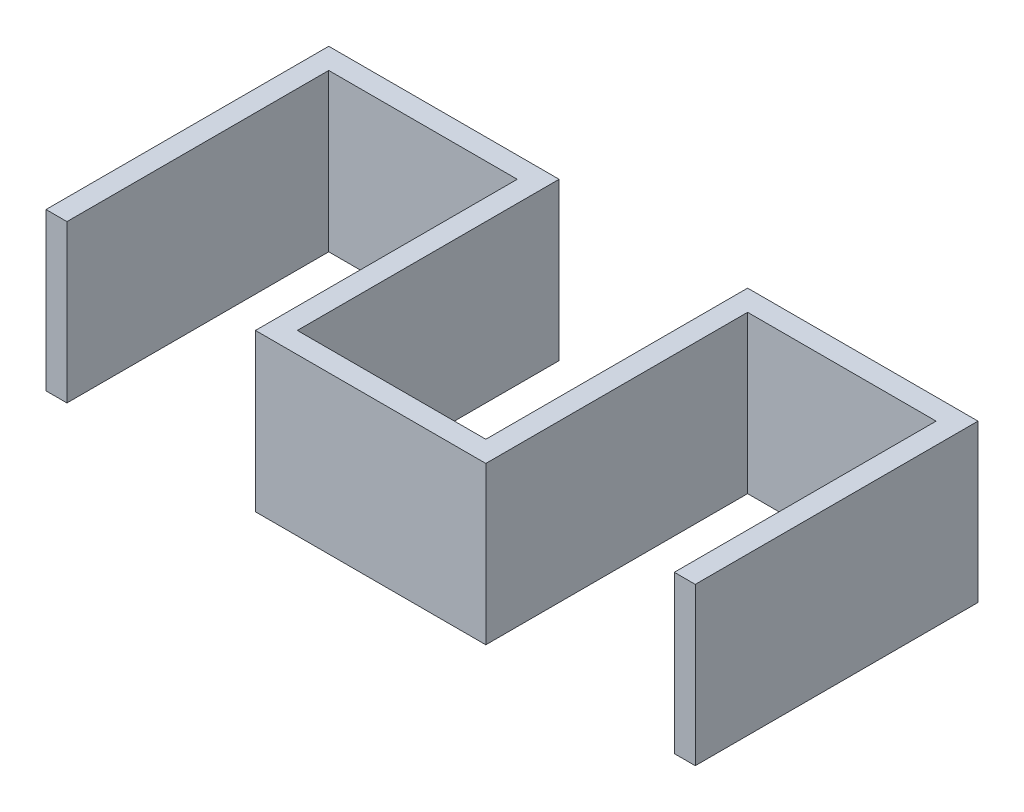
ISO-10303-21;
HEADER;
FILE_DESCRIPTION(('STEP AP214'),'2;1');
FILE_NAME('part.step','',(''),(''),'','','');
FILE_SCHEMA(('AUTOMOTIVE_DESIGN { 1 0 10303 214 1 1 1 1 }'));
ENDSEC;
DATA;
#1=APPLICATION_CONTEXT('core data for automotive mechanical design processes');
#2=APPLICATION_PROTOCOL_DEFINITION('international standard','automotive_design',2000,#1);
#3=PRODUCT_CONTEXT('',#1,'mechanical');
#4=PRODUCT('Part','Part','',(#3));
#5=PRODUCT_RELATED_PRODUCT_CATEGORY('part','',(#4));
#6=PRODUCT_DEFINITION_FORMATION('','',#4);
#7=PRODUCT_DEFINITION_CONTEXT('part definition',#1,'design');
#8=PRODUCT_DEFINITION('design','',#6,#7);
#9=PRODUCT_DEFINITION_SHAPE('','',#8);
#10=(LENGTH_UNIT() NAMED_UNIT(*) SI_UNIT(.MILLI.,.METRE.));
#11=(NAMED_UNIT(*) PLANE_ANGLE_UNIT() SI_UNIT($,.RADIAN.));
#12=(NAMED_UNIT(*) SI_UNIT($,.STERADIAN.) SOLID_ANGLE_UNIT());
#13=UNCERTAINTY_MEASURE_WITH_UNIT(LENGTH_MEASURE(1.E-05),#10,'distance_accuracy_value','');
#14=(GEOMETRIC_REPRESENTATION_CONTEXT(3) GLOBAL_UNCERTAINTY_ASSIGNED_CONTEXT((#13)) GLOBAL_UNIT_ASSIGNED_CONTEXT((#10,
#11,#12)) REPRESENTATION_CONTEXT('',''));
#15=CARTESIAN_POINT('',(0.,0.,0.));
#16=DIRECTION('',(0.,0.,1.));
#17=DIRECTION('',(1.,0.,0.));
#18=AXIS2_PLACEMENT_3D('',#15,#16,#17);
#19=CARTESIAN_POINT('',(58.,15.,-25.));
#20=DIRECTION('',(1.,0.,0.));
#21=DIRECTION('',(0.,0.,-1.));
#22=AXIS2_PLACEMENT_3D('',#19,#20,#21);
#23=PLANE('',#22);
#24=DIRECTION('',(0.,0.,1.));
#25=VECTOR('',#24,1.);
#26=CARTESIAN_POINT('',(58.,0.,-25.));
#27=LINE('',#26,#25);
#28=CARTESIAN_POINT('',(58.,0.,-25.));
#29=VERTEX_POINT('',#28);
#30=CARTESIAN_POINT('',(58.,0.,0.));
#31=VERTEX_POINT('',#30);
#32=EDGE_CURVE('E182',#29,#31,#27,.T.);
#33=ORIENTED_EDGE('',*,*,#32,.T.);
#34=DIRECTION('',(0.,-1.,0.));
#35=VECTOR('',#34,1.);
#36=CARTESIAN_POINT('',(58.,15.,0.));
#37=LINE('',#36,#35);
#38=CARTESIAN_POINT('',(58.,15.,0.));
#39=VERTEX_POINT('',#38);
#40=EDGE_CURVE('E11',#39,#31,#37,.T.);
#41=ORIENTED_EDGE('',*,*,#40,.F.);
#42=DIRECTION('',(0.,0.,1.));
#43=VECTOR('',#42,1.);
#44=CARTESIAN_POINT('',(58.,15.,-25.));
#45=LINE('',#44,#43);
#46=CARTESIAN_POINT('',(58.,15.,-25.));
#47=VERTEX_POINT('',#46);
#48=EDGE_CURVE('E119',#47,#39,#45,.T.);
#49=ORIENTED_EDGE('',*,*,#48,.F.);
#50=DIRECTION('',(0.,-1.,0.));
#51=VECTOR('',#50,1.);
#52=CARTESIAN_POINT('',(58.,15.,-25.));
#53=LINE('',#52,#51);
#54=EDGE_CURVE('E178',#47,#29,#53,.T.);
#55=ORIENTED_EDGE('',*,*,#54,.T.);
#56=EDGE_LOOP('',(#33,#41,#49,#55));
#57=FACE_BOUND('',#56,.T.);
#58=ADVANCED_FACE('F39',(#57),#23,.F.);
#59=CARTESIAN_POINT('',(60.,15.,0.));
#60=DIRECTION('',(0.,0.,1.));
#61=DIRECTION('',(1.,0.,0.));
#62=AXIS2_PLACEMENT_3D('',#59,#60,#61);
#63=PLANE('',#62);
#64=DIRECTION('',(-1.,0.,0.));
#65=VECTOR('',#64,1.);
#66=CARTESIAN_POINT('',(60.,0.,0.));
#67=LINE('',#66,#65);
#68=CARTESIAN_POINT('',(60.,0.,0.));
#69=VERTEX_POINT('',#68);
#70=EDGE_CURVE('E185',#69,#31,#67,.T.);
#71=ORIENTED_EDGE('',*,*,#70,.F.);
#72=DIRECTION('',(0.,-1.,0.));
#73=VECTOR('',#72,1.);
#74=CARTESIAN_POINT('',(60.,15.,0.));
#75=LINE('',#74,#73);
#76=CARTESIAN_POINT('',(60.,15.,0.));
#77=VERTEX_POINT('',#76);
#78=EDGE_CURVE('E47',#77,#69,#75,.T.);
#79=ORIENTED_EDGE('',*,*,#78,.F.);
#80=DIRECTION('',(-1.,0.,0.));
#81=VECTOR('',#80,1.);
#82=CARTESIAN_POINT('',(60.,15.,0.));
#83=LINE('',#82,#81);
#84=EDGE_CURVE('E267',#77,#39,#83,.T.);
#85=ORIENTED_EDGE('',*,*,#84,.T.);
#86=ORIENTED_EDGE('',*,*,#40,.T.);
#87=EDGE_LOOP('',(#71,#79,#85,#86));
#88=FACE_BOUND('',#87,.T.);
#89=ADVANCED_FACE('F254',(#88),#63,.T.);
#90=CARTESIAN_POINT('',(60.,15.,-25.));
#91=DIRECTION('',(1.,0.,0.));
#92=DIRECTION('',(0.,0.,-1.));
#93=AXIS2_PLACEMENT_3D('',#90,#91,#92);
#94=PLANE('',#93);
#95=DIRECTION('',(0.,0.,-1.));
#96=VECTOR('',#95,1.);
#97=CARTESIAN_POINT('',(60.,0.,-25.));
#98=LINE('',#97,#96);
#99=CARTESIAN_POINT('',(60.,0.,-27.));
#100=VERTEX_POINT('',#99);
#101=EDGE_CURVE('E188',#100,#69,#98,.F.);
#102=ORIENTED_EDGE('',*,*,#101,.F.);
#103=DIRECTION('',(0.,-1.,0.));
#104=VECTOR('',#103,1.);
#105=CARTESIAN_POINT('',(60.,15.,-27.));
#106=LINE('',#105,#104);
#107=CARTESIAN_POINT('',(60.,15.,-27.));
#108=VERTEX_POINT('',#107);
#109=EDGE_CURVE('E244',#108,#100,#106,.T.);
#110=ORIENTED_EDGE('',*,*,#109,.F.);
#111=DIRECTION('',(0.,0.,-1.));
#112=VECTOR('',#111,1.);
#113=CARTESIAN_POINT('',(60.,15.,-25.));
#114=LINE('',#113,#112);
#115=EDGE_CURVE('E251',#108,#77,#114,.F.);
#116=ORIENTED_EDGE('',*,*,#115,.T.);
#117=ORIENTED_EDGE('',*,*,#78,.T.);
#118=EDGE_LOOP('',(#102,#110,#116,#117));
#119=FACE_BOUND('',#118,.T.);
#120=ADVANCED_FACE('F249',(#119),#94,.T.);
#121=CARTESIAN_POINT('',(40.,15.,-27.));
#122=DIRECTION('',(0.,0.,-1.));
#123=DIRECTION('',(-1.,0.,0.));
#124=AXIS2_PLACEMENT_3D('',#121,#122,#123);
#125=PLANE('',#124);
#126=DIRECTION('',(1.,0.,0.));
#127=VECTOR('',#126,1.);
#128=CARTESIAN_POINT('',(40.,0.,-27.));
#129=LINE('',#128,#127);
#130=CARTESIAN_POINT('',(38.,0.,-27.));
#131=VERTEX_POINT('',#130);
#132=EDGE_CURVE('E191',#131,#100,#129,.T.);
#133=ORIENTED_EDGE('',*,*,#132,.F.);
#134=DIRECTION('',(0.,-1.,0.));
#135=VECTOR('',#134,1.);
#136=CARTESIAN_POINT('',(38.,15.,-27.));
#137=LINE('',#136,#135);
#138=CARTESIAN_POINT('',(38.,15.,-27.));
#139=VERTEX_POINT('',#138);
#140=EDGE_CURVE('E242',#139,#131,#137,.T.);
#141=ORIENTED_EDGE('',*,*,#140,.F.);
#142=DIRECTION('',(1.,0.,0.));
#143=VECTOR('',#142,1.);
#144=CARTESIAN_POINT('',(40.,15.,-27.));
#145=LINE('',#144,#143);
#146=EDGE_CURVE('E264',#139,#108,#145,.T.);
#147=ORIENTED_EDGE('',*,*,#146,.T.);
#148=ORIENTED_EDGE('',*,*,#109,.T.);
#149=EDGE_LOOP('',(#133,#141,#147,#148));
#150=FACE_BOUND('',#149,.T.);
#151=ADVANCED_FACE('F261',(#150),#125,.T.);
#152=CARTESIAN_POINT('',(38.,15.,0.));
#153=DIRECTION('',(-1.,0.,0.));
#154=DIRECTION('',(0.,0.,1.));
#155=AXIS2_PLACEMENT_3D('',#152,#153,#154);
#156=PLANE('',#155);
#157=DIRECTION('',(0.,0.,-1.));
#158=VECTOR('',#157,1.);
#159=CARTESIAN_POINT('',(38.,0.,0.));
#160=LINE('',#159,#158);
#161=CARTESIAN_POINT('',(38.,0.,-2.));
#162=VERTEX_POINT('',#161);
#163=EDGE_CURVE('E194',#162,#131,#160,.T.);
#164=ORIENTED_EDGE('',*,*,#163,.F.);
#165=DIRECTION('',(0.,-1.,0.));
#166=VECTOR('',#165,1.);
#167=CARTESIAN_POINT('',(38.,15.,-2.));
#168=LINE('',#167,#166);
#169=CARTESIAN_POINT('',(38.,15.,-2.));
#170=VERTEX_POINT('',#169);
#171=EDGE_CURVE('E240',#170,#162,#168,.T.);
#172=ORIENTED_EDGE('',*,*,#171,.F.);
#173=DIRECTION('',(0.,0.,-1.));
#174=VECTOR('',#173,1.);
#175=CARTESIAN_POINT('',(38.,15.,0.));
#176=LINE('',#175,#174);
#177=EDGE_CURVE('E269',#170,#139,#176,.T.);
#178=ORIENTED_EDGE('',*,*,#177,.T.);
#179=ORIENTED_EDGE('',*,*,#140,.T.);
#180=EDGE_LOOP('',(#164,#172,#178,#179));
#181=FACE_BOUND('',#180,.T.);
#182=ADVANCED_FACE('F326',(#181),#156,.T.);
#183=CARTESIAN_POINT('',(18.,15.,-2.));
#184=DIRECTION('',(0.,0.,-1.));
#185=DIRECTION('',(-1.,0.,0.));
#186=AXIS2_PLACEMENT_3D('',#183,#184,#185);
#187=PLANE('',#186);
#188=DIRECTION('',(1.,0.,0.));
#189=VECTOR('',#188,1.);
#190=CARTESIAN_POINT('',(18.,0.,-2.));
#191=LINE('',#190,#189);
#192=CARTESIAN_POINT('',(20.,0.,-2.));
#193=VERTEX_POINT('',#192);
#194=EDGE_CURVE('E197',#193,#162,#191,.T.);
#195=ORIENTED_EDGE('',*,*,#194,.F.);
#196=DIRECTION('',(0.,-1.,0.));
#197=VECTOR('',#196,1.);
#198=CARTESIAN_POINT('',(20.,15.,-2.));
#199=LINE('',#198,#197);
#200=CARTESIAN_POINT('',(20.,15.,-2.));
#201=VERTEX_POINT('',#200);
#202=EDGE_CURVE('E238',#201,#193,#199,.T.);
#203=ORIENTED_EDGE('',*,*,#202,.F.);
#204=DIRECTION('',(1.,0.,0.));
#205=VECTOR('',#204,1.);
#206=CARTESIAN_POINT('',(18.,15.,-2.));
#207=LINE('',#206,#205);
#208=EDGE_CURVE('E275',#201,#170,#207,.T.);
#209=ORIENTED_EDGE('',*,*,#208,.T.);
#210=ORIENTED_EDGE('',*,*,#171,.T.);
#211=EDGE_LOOP('',(#195,#203,#209,#210));
#212=FACE_BOUND('',#211,.T.);
#213=ADVANCED_FACE('F329',(#212),#187,.T.);
#214=CARTESIAN_POINT('',(20.,15.,-25.));
#215=DIRECTION('',(1.,0.,0.));
#216=DIRECTION('',(0.,0.,-1.));
#217=AXIS2_PLACEMENT_3D('',#214,#215,#216);
#218=PLANE('',#217);
#219=DIRECTION('',(0.,0.,1.));
#220=VECTOR('',#219,1.);
#221=CARTESIAN_POINT('',(20.,0.,-25.));
#222=LINE('',#221,#220);
#223=CARTESIAN_POINT('',(20.,0.,-27.));
#224=VERTEX_POINT('',#223);
#225=EDGE_CURVE('E200',#224,#193,#222,.T.);
#226=ORIENTED_EDGE('',*,*,#225,.F.);
#227=DIRECTION('',(0.,-1.,0.));
#228=VECTOR('',#227,1.);
#229=CARTESIAN_POINT('',(20.,15.,-27.));
#230=LINE('',#229,#228);
#231=CARTESIAN_POINT('',(20.,15.,-27.));
#232=VERTEX_POINT('',#231);
#233=EDGE_CURVE('E236',#232,#224,#230,.T.);
#234=ORIENTED_EDGE('',*,*,#233,.F.);
#235=DIRECTION('',(0.,0.,1.));
#236=VECTOR('',#235,1.);
#237=CARTESIAN_POINT('',(20.,15.,-25.));
#238=LINE('',#237,#236);
#239=EDGE_CURVE('E278',#232,#201,#238,.T.);
#240=ORIENTED_EDGE('',*,*,#239,.T.);
#241=ORIENTED_EDGE('',*,*,#202,.T.);
#242=EDGE_LOOP('',(#226,#234,#240,#241));
#243=FACE_BOUND('',#242,.T.);
#244=ADVANCED_FACE('F333',(#243),#218,.T.);
#245=CARTESIAN_POINT('',(0.,15.,-27.));
#246=DIRECTION('',(0.,0.,-1.));
#247=DIRECTION('',(-1.,0.,0.));
#248=AXIS2_PLACEMENT_3D('',#245,#246,#247);
#249=PLANE('',#248);
#250=DIRECTION('',(1.,0.,0.));
#251=VECTOR('',#250,1.);
#252=CARTESIAN_POINT('',(0.,0.,-27.));
#253=LINE('',#252,#251);
#254=CARTESIAN_POINT('',(-2.,0.,-27.));
#255=VERTEX_POINT('',#254);
#256=EDGE_CURVE('E203',#255,#224,#253,.T.);
#257=ORIENTED_EDGE('',*,*,#256,.F.);
#258=DIRECTION('',(0.,-1.,0.));
#259=VECTOR('',#258,1.);
#260=CARTESIAN_POINT('',(-2.,15.,-27.));
#261=LINE('',#260,#259);
#262=CARTESIAN_POINT('',(-2.,15.,-27.));
#263=VERTEX_POINT('',#262);
#264=EDGE_CURVE('E234',#263,#255,#261,.T.);
#265=ORIENTED_EDGE('',*,*,#264,.F.);
#266=DIRECTION('',(1.,0.,0.));
#267=VECTOR('',#266,1.);
#268=CARTESIAN_POINT('',(0.,15.,-27.));
#269=LINE('',#268,#267);
#270=EDGE_CURVE('E281',#263,#232,#269,.T.);
#271=ORIENTED_EDGE('',*,*,#270,.T.);
#272=ORIENTED_EDGE('',*,*,#233,.T.);
#273=EDGE_LOOP('',(#257,#265,#271,#272));
#274=FACE_BOUND('',#273,.T.);
#275=ADVANCED_FACE('F337',(#274),#249,.T.);
#276=CARTESIAN_POINT('',(-2.,15.,0.));
#277=DIRECTION('',(-1.,0.,0.));
#278=DIRECTION('',(0.,0.,1.));
#279=AXIS2_PLACEMENT_3D('',#276,#277,#278);
#280=PLANE('',#279);
#281=DIRECTION('',(0.,0.,-1.));
#282=VECTOR('',#281,1.);
#283=CARTESIAN_POINT('',(-2.,0.,0.));
#284=LINE('',#283,#282);
#285=CARTESIAN_POINT('',(-2.,0.,0.));
#286=VERTEX_POINT('',#285);
#287=EDGE_CURVE('E206',#286,#255,#284,.T.);
#288=ORIENTED_EDGE('',*,*,#287,.F.);
#289=DIRECTION('',(0.,-1.,0.));
#290=VECTOR('',#289,1.);
#291=CARTESIAN_POINT('',(-2.,15.,0.));
#292=LINE('',#291,#290);
#293=CARTESIAN_POINT('',(-2.,15.,0.));
#294=VERTEX_POINT('',#293);
#295=EDGE_CURVE('E232',#294,#286,#292,.T.);
#296=ORIENTED_EDGE('',*,*,#295,.F.);
#297=DIRECTION('',(0.,0.,-1.));
#298=VECTOR('',#297,1.);
#299=CARTESIAN_POINT('',(-2.,15.,0.));
#300=LINE('',#299,#298);
#301=EDGE_CURVE('E284',#294,#263,#300,.T.);
#302=ORIENTED_EDGE('',*,*,#301,.T.);
#303=ORIENTED_EDGE('',*,*,#264,.T.);
#304=EDGE_LOOP('',(#288,#296,#302,#303));
#305=FACE_BOUND('',#304,.T.);
#306=ADVANCED_FACE('F341',(#305),#280,.T.);
#307=CARTESIAN_POINT('',(0.,15.,0.));
#308=DIRECTION('',(0.,0.,1.));
#309=DIRECTION('',(1.,0.,0.));
#310=AXIS2_PLACEMENT_3D('',#307,#308,#309);
#311=PLANE('',#310);
#312=DIRECTION('',(-1.,0.,0.));
#313=VECTOR('',#312,1.);
#314=CARTESIAN_POINT('',(0.,0.,0.));
#315=LINE('',#314,#313);
#316=CARTESIAN_POINT('',(0.,0.,0.));
#317=VERTEX_POINT('',#316);
#318=EDGE_CURVE('E209',#317,#286,#315,.T.);
#319=ORIENTED_EDGE('',*,*,#318,.F.);
#320=DIRECTION('',(0.,-1.,0.));
#321=VECTOR('',#320,1.);
#322=CARTESIAN_POINT('',(0.,15.,0.));
#323=LINE('',#322,#321);
#324=CARTESIAN_POINT('',(0.,15.,0.));
#325=VERTEX_POINT('',#324);
#326=EDGE_CURVE('E230',#325,#317,#323,.T.);
#327=ORIENTED_EDGE('',*,*,#326,.F.);
#328=DIRECTION('',(-1.,0.,0.));
#329=VECTOR('',#328,1.);
#330=CARTESIAN_POINT('',(0.,15.,0.));
#331=LINE('',#330,#329);
#332=EDGE_CURVE('E287',#325,#294,#331,.T.);
#333=ORIENTED_EDGE('',*,*,#332,.T.);
#334=ORIENTED_EDGE('',*,*,#295,.T.);
#335=EDGE_LOOP('',(#319,#327,#333,#334));
#336=FACE_BOUND('',#335,.T.);
#337=ADVANCED_FACE('F345',(#336),#311,.T.);
#338=CARTESIAN_POINT('',(0.,15.,0.));
#339=DIRECTION('',(-1.,0.,0.));
#340=DIRECTION('',(0.,0.,1.));
#341=AXIS2_PLACEMENT_3D('',#338,#339,#340);
#342=PLANE('',#341);
#343=DIRECTION('',(0.,0.,-1.));
#344=VECTOR('',#343,1.);
#345=CARTESIAN_POINT('',(0.,0.,0.));
#346=LINE('',#345,#344);
#347=CARTESIAN_POINT('',(0.,0.,-25.));
#348=VERTEX_POINT('',#347);
#349=EDGE_CURVE('E212',#317,#348,#346,.T.);
#350=ORIENTED_EDGE('',*,*,#349,.T.);
#351=DIRECTION('',(0.,-1.,0.));
#352=VECTOR('',#351,1.);
#353=CARTESIAN_POINT('',(0.,15.,-25.));
#354=LINE('',#353,#352);
#355=CARTESIAN_POINT('',(0.,15.,-25.));
#356=VERTEX_POINT('',#355);
#357=EDGE_CURVE('E227',#356,#348,#354,.T.);
#358=ORIENTED_EDGE('',*,*,#357,.F.);
#359=DIRECTION('',(0.,0.,-1.));
#360=VECTOR('',#359,1.);
#361=CARTESIAN_POINT('',(0.,15.,0.));
#362=LINE('',#361,#360);
#363=EDGE_CURVE('E290',#325,#356,#362,.T.);
#364=ORIENTED_EDGE('',*,*,#363,.F.);
#365=ORIENTED_EDGE('',*,*,#326,.T.);
#366=EDGE_LOOP('',(#350,#358,#364,#365));
#367=FACE_BOUND('',#366,.T.);
#368=ADVANCED_FACE('F349',(#367),#342,.F.);
#369=CARTESIAN_POINT('',(0.,15.,-25.));
#370=DIRECTION('',(0.,0.,-1.));
#371=DIRECTION('',(-1.,0.,0.));
#372=AXIS2_PLACEMENT_3D('',#369,#370,#371);
#373=PLANE('',#372);
#374=DIRECTION('',(1.,0.,0.));
#375=VECTOR('',#374,1.);
#376=CARTESIAN_POINT('',(0.,0.,-25.));
#377=LINE('',#376,#375);
#378=CARTESIAN_POINT('',(18.,0.,-25.));
#379=VERTEX_POINT('',#378);
#380=EDGE_CURVE('E214',#348,#379,#377,.T.);
#381=ORIENTED_EDGE('',*,*,#380,.T.);
#382=DIRECTION('',(0.,-1.,0.));
#383=VECTOR('',#382,1.);
#384=CARTESIAN_POINT('',(18.,15.,-25.));
#385=LINE('',#384,#383);
#386=CARTESIAN_POINT('',(18.,15.,-25.));
#387=VERTEX_POINT('',#386);
#388=EDGE_CURVE('E224',#387,#379,#385,.T.);
#389=ORIENTED_EDGE('',*,*,#388,.F.);
#390=DIRECTION('',(1.,0.,0.));
#391=VECTOR('',#390,1.);
#392=CARTESIAN_POINT('',(0.,15.,-25.));
#393=LINE('',#392,#391);
#394=EDGE_CURVE('E292',#356,#387,#393,.T.);
#395=ORIENTED_EDGE('',*,*,#394,.F.);
#396=ORIENTED_EDGE('',*,*,#357,.T.);
#397=EDGE_LOOP('',(#381,#389,#395,#396));
#398=FACE_BOUND('',#397,.T.);
#399=ADVANCED_FACE('F299',(#398),#373,.F.);
#400=CARTESIAN_POINT('',(18.,15.,-25.));
#401=DIRECTION('',(1.,0.,0.));
#402=DIRECTION('',(0.,0.,-1.));
#403=AXIS2_PLACEMENT_3D('',#400,#401,#402);
#404=PLANE('',#403);
#405=DIRECTION('',(0.,0.,1.));
#406=VECTOR('',#405,1.);
#407=CARTESIAN_POINT('',(18.,0.,-25.));
#408=LINE('',#407,#406);
#409=CARTESIAN_POINT('',(18.,0.,0.));
#410=VERTEX_POINT('',#409);
#411=EDGE_CURVE('E216',#379,#410,#408,.T.);
#412=ORIENTED_EDGE('',*,*,#411,.T.);
#413=DIRECTION('',(0.,-1.,0.));
#414=VECTOR('',#413,1.);
#415=CARTESIAN_POINT('',(18.,15.,0.));
#416=LINE('',#415,#414);
#417=CARTESIAN_POINT('',(18.,15.,0.));
#418=VERTEX_POINT('',#417);
#419=EDGE_CURVE('E173',#418,#410,#416,.T.);
#420=ORIENTED_EDGE('',*,*,#419,.F.);
#421=DIRECTION('',(0.,0.,1.));
#422=VECTOR('',#421,1.);
#423=CARTESIAN_POINT('',(18.,15.,-25.));
#424=LINE('',#423,#422);
#425=EDGE_CURVE('E164',#387,#418,#424,.T.);
#426=ORIENTED_EDGE('',*,*,#425,.F.);
#427=ORIENTED_EDGE('',*,*,#388,.T.);
#428=EDGE_LOOP('',(#412,#420,#426,#427));
#429=FACE_BOUND('',#428,.T.);
#430=ADVANCED_FACE('F303',(#429),#404,.F.);
#431=CARTESIAN_POINT('',(18.,15.,0.));
#432=DIRECTION('',(0.,0.,-1.));
#433=DIRECTION('',(-1.,0.,0.));
#434=AXIS2_PLACEMENT_3D('',#431,#432,#433);
#435=PLANE('',#434);
#436=DIRECTION('',(1.,0.,0.));
#437=VECTOR('',#436,1.);
#438=CARTESIAN_POINT('',(18.,0.,0.));
#439=LINE('',#438,#437);
#440=CARTESIAN_POINT('',(40.,0.,0.));
#441=VERTEX_POINT('',#440);
#442=EDGE_CURVE('E172',#410,#441,#439,.T.);
#443=ORIENTED_EDGE('',*,*,#442,.T.);
#444=DIRECTION('',(0.,-1.,0.));
#445=VECTOR('',#444,1.);
#446=CARTESIAN_POINT('',(40.,15.,0.));
#447=LINE('',#446,#445);
#448=CARTESIAN_POINT('',(40.,15.,0.));
#449=VERTEX_POINT('',#448);
#450=EDGE_CURVE('E169',#449,#441,#447,.T.);
#451=ORIENTED_EDGE('',*,*,#450,.F.);
#452=DIRECTION('',(1.,0.,0.));
#453=VECTOR('',#452,1.);
#454=CARTESIAN_POINT('',(18.,15.,0.));
#455=LINE('',#454,#453);
#456=EDGE_CURVE('E158',#418,#449,#455,.T.);
#457=ORIENTED_EDGE('',*,*,#456,.F.);
#458=ORIENTED_EDGE('',*,*,#419,.T.);
#459=EDGE_LOOP('',(#443,#451,#457,#458));
#460=FACE_BOUND('',#459,.T.);
#461=ADVANCED_FACE('F170',(#460),#435,.F.);
#462=CARTESIAN_POINT('',(40.,15.,0.));
#463=DIRECTION('',(-1.,0.,0.));
#464=DIRECTION('',(0.,0.,1.));
#465=AXIS2_PLACEMENT_3D('',#462,#463,#464);
#466=PLANE('',#465);
#467=DIRECTION('',(0.,0.,-1.));
#468=VECTOR('',#467,1.);
#469=CARTESIAN_POINT('',(40.,0.,0.));
#470=LINE('',#469,#468);
#471=CARTESIAN_POINT('',(40.,0.,-25.));
#472=VERTEX_POINT('',#471);
#473=EDGE_CURVE('E107',#441,#472,#470,.T.);
#474=ORIENTED_EDGE('',*,*,#473,.T.);
#475=DIRECTION('',(0.,-1.,0.));
#476=VECTOR('',#475,1.);
#477=CARTESIAN_POINT('',(40.,15.,-25.));
#478=LINE('',#477,#476);
#479=CARTESIAN_POINT('',(40.,15.,-25.));
#480=VERTEX_POINT('',#479);
#481=EDGE_CURVE('E174',#480,#472,#478,.T.);
#482=ORIENTED_EDGE('',*,*,#481,.F.);
#483=DIRECTION('',(0.,0.,-1.));
#484=VECTOR('',#483,1.);
#485=CARTESIAN_POINT('',(40.,15.,0.));
#486=LINE('',#485,#484);
#487=EDGE_CURVE('E162',#449,#480,#486,.T.);
#488=ORIENTED_EDGE('',*,*,#487,.F.);
#489=ORIENTED_EDGE('',*,*,#450,.T.);
#490=EDGE_LOOP('',(#474,#482,#488,#489));
#491=FACE_BOUND('',#490,.T.);
#492=ADVANCED_FACE('F176',(#491),#466,.F.);
#493=CARTESIAN_POINT('',(40.,15.,-25.));
#494=DIRECTION('',(0.,0.,-1.));
#495=DIRECTION('',(-1.,0.,0.));
#496=AXIS2_PLACEMENT_3D('',#493,#494,#495);
#497=PLANE('',#496);
#498=DIRECTION('',(1.,0.,0.));
#499=VECTOR('',#498,1.);
#500=CARTESIAN_POINT('',(40.,0.,-25.));
#501=LINE('',#500,#499);
#502=EDGE_CURVE('E113',#472,#29,#501,.T.);
#503=ORIENTED_EDGE('',*,*,#502,.T.);
#504=ORIENTED_EDGE('',*,*,#54,.F.);
#505=DIRECTION('',(1.,0.,0.));
#506=VECTOR('',#505,1.);
#507=CARTESIAN_POINT('',(40.,15.,-25.));
#508=LINE('',#507,#506);
#509=EDGE_CURVE('E55',#480,#47,#508,.T.);
#510=ORIENTED_EDGE('',*,*,#509,.F.);
#511=ORIENTED_EDGE('',*,*,#481,.T.);
#512=EDGE_LOOP('',(#503,#504,#510,#511));
#513=FACE_BOUND('',#512,.T.);
#514=ADVANCED_FACE('F305',(#513),#497,.F.);
#515=CARTESIAN_POINT('',(0.,15.,0.));
#516=DIRECTION('',(0.,-1.,0.));
#517=DIRECTION('',(-1.,0.,0.));
#518=AXIS2_PLACEMENT_3D('',#515,#516,#517);
#519=PLANE('',#518);
#520=ORIENTED_EDGE('',*,*,#48,.T.);
#521=ORIENTED_EDGE('',*,*,#84,.F.);
#522=ORIENTED_EDGE('',*,*,#115,.F.);
#523=ORIENTED_EDGE('',*,*,#146,.F.);
#524=ORIENTED_EDGE('',*,*,#177,.F.);
#525=ORIENTED_EDGE('',*,*,#208,.F.);
#526=ORIENTED_EDGE('',*,*,#239,.F.);
#527=ORIENTED_EDGE('',*,*,#270,.F.);
#528=ORIENTED_EDGE('',*,*,#301,.F.);
#529=ORIENTED_EDGE('',*,*,#332,.F.);
#530=ORIENTED_EDGE('',*,*,#363,.T.);
#531=ORIENTED_EDGE('',*,*,#394,.T.);
#532=ORIENTED_EDGE('',*,*,#425,.T.);
#533=ORIENTED_EDGE('',*,*,#456,.T.);
#534=ORIENTED_EDGE('',*,*,#487,.T.);
#535=ORIENTED_EDGE('',*,*,#509,.T.);
#536=EDGE_LOOP('',(#520,#521,#522,#523,#524,#525,#526,#527,#528,#529,#530,#531,#532,#533,#534,#535));
#537=FACE_BOUND('',#536,.T.);
#538=ADVANCED_FACE('F160',(#537),#519,.F.);
#539=CARTESIAN_POINT('',(0.,0.,0.));
#540=DIRECTION('',(0.,-1.,0.));
#541=DIRECTION('',(-1.,0.,0.));
#542=AXIS2_PLACEMENT_3D('',#539,#540,#541);
#543=PLANE('',#542);
#544=ORIENTED_EDGE('',*,*,#32,.F.);
#545=ORIENTED_EDGE('',*,*,#502,.F.);
#546=ORIENTED_EDGE('',*,*,#473,.F.);
#547=ORIENTED_EDGE('',*,*,#442,.F.);
#548=ORIENTED_EDGE('',*,*,#411,.F.);
#549=ORIENTED_EDGE('',*,*,#380,.F.);
#550=ORIENTED_EDGE('',*,*,#349,.F.);
#551=ORIENTED_EDGE('',*,*,#318,.T.);
#552=ORIENTED_EDGE('',*,*,#287,.T.);
#553=ORIENTED_EDGE('',*,*,#256,.T.);
#554=ORIENTED_EDGE('',*,*,#225,.T.);
#555=ORIENTED_EDGE('',*,*,#194,.T.);
#556=ORIENTED_EDGE('',*,*,#163,.T.);
#557=ORIENTED_EDGE('',*,*,#132,.T.);
#558=ORIENTED_EDGE('',*,*,#101,.T.);
#559=ORIENTED_EDGE('',*,*,#70,.T.);
#560=EDGE_LOOP('',(#544,#545,#546,#547,#548,#549,#550,#551,#552,#553,#554,#555,#556,#557,#558,#559));
#561=FACE_BOUND('',#560,.T.);
#562=ADVANCED_FACE('F257',(#561),#543,.T.);
#563=CLOSED_SHELL('',(#58,#89,#120,#151,#182,#213,#244,#275,#306,#337,#368,#399,#430,#461,#492,
#514,#538,#562));
#564=MANIFOLD_SOLID_BREP('B2',#563);
#565=ADVANCED_BREP_SHAPE_REPRESENTATION('',(#18,#564),#14);
#566=SHAPE_DEFINITION_REPRESENTATION(#9,#565);
ENDSEC;
END-ISO-10303-21;
